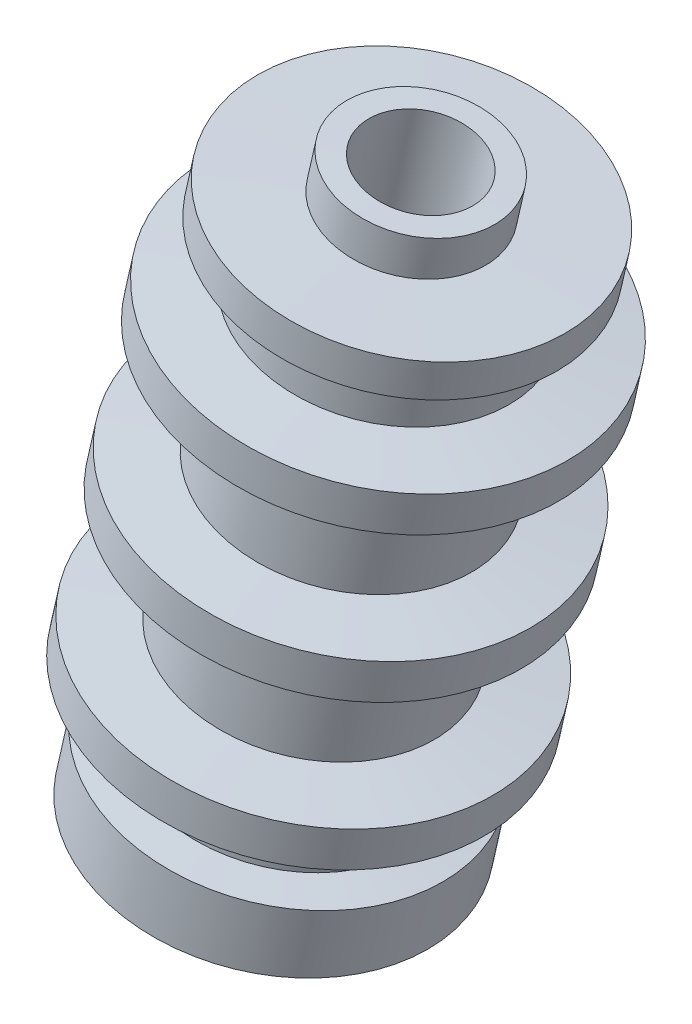
ISO-10303-21;
HEADER;
FILE_DESCRIPTION(('STEP AP214'),'2;1');
FILE_NAME('part.step','',(''),(''),'','','');
FILE_SCHEMA(('AUTOMOTIVE_DESIGN { 1 0 10303 214 1 1 1 1 }'));
ENDSEC;
DATA;
#1=APPLICATION_CONTEXT('core data for automotive mechanical design processes');
#2=APPLICATION_PROTOCOL_DEFINITION('international standard','automotive_design',2000,#1);
#3=PRODUCT_CONTEXT('',#1,'mechanical');
#4=PRODUCT('Part','Part','',(#3));
#5=PRODUCT_RELATED_PRODUCT_CATEGORY('part','',(#4));
#6=PRODUCT_DEFINITION_FORMATION('','',#4);
#7=PRODUCT_DEFINITION_CONTEXT('part definition',#1,'design');
#8=PRODUCT_DEFINITION('design','',#6,#7);
#9=PRODUCT_DEFINITION_SHAPE('','',#8);
#10=(LENGTH_UNIT() NAMED_UNIT(*) SI_UNIT(.MILLI.,.METRE.));
#11=(NAMED_UNIT(*) PLANE_ANGLE_UNIT() SI_UNIT($,.RADIAN.));
#12=(NAMED_UNIT(*) SI_UNIT($,.STERADIAN.) SOLID_ANGLE_UNIT());
#13=UNCERTAINTY_MEASURE_WITH_UNIT(LENGTH_MEASURE(1.E-05),#10,'distance_accuracy_value','');
#14=(GEOMETRIC_REPRESENTATION_CONTEXT(3) GLOBAL_UNCERTAINTY_ASSIGNED_CONTEXT((#13)) GLOBAL_UNIT_ASSIGNED_CONTEXT((#10,
#11,#12)) REPRESENTATION_CONTEXT('',''));
#15=CARTESIAN_POINT('',(0.,0.,0.));
#16=DIRECTION('',(0.,0.,1.));
#17=DIRECTION('',(1.,0.,0.));
#18=AXIS2_PLACEMENT_3D('',#15,#16,#17);
#19=CARTESIAN_POINT('',(23.4539001258529,-5.09677043690606,0.));
#20=DIRECTION('',(0.222520933956315,0.974927912181823,0.));
#21=DIRECTION('',(-0.974927912181823,0.222520933956315,0.));
#22=AXIS2_PLACEMENT_3D('',#19,#20,#21);
#23=CYLINDRICAL_SURFACE('',#22,4.5);
#24=CARTESIAN_POINT('',(23.2870094253804,-5.82796637106546,0.));
#25=DIRECTION('',(0.222520933956315,0.974927912181824,0.));
#26=DIRECTION('',(0.583888781232773,-0.133268804085998,-0.800820402467366));
#27=AXIS2_PLACEMENT_3D('',#24,#25,#26);
#28=CIRCLE('',#27,4.49999999995279);
#29=CARTESIAN_POINT('',(25.9145089409003,-6.42767598944616,-3.60369181106535));
#30=VERTEX_POINT('',#29);
#31=EDGE_CURVE('E83',#30,#30,#28,.F.);
#32=ORIENTED_EDGE('',*,*,#31,.F.);
#33=EDGE_LOOP('',(#32));
#34=FACE_BOUND('',#33,.T.);
#35=CARTESIAN_POINT('',(23.5095303593415,-4.85303845886247,0.));
#36=DIRECTION('',(-0.222520933956315,-0.974927912181824,0.));
#37=DIRECTION('',(-0.583888781246894,0.133268804089222,0.800820402456534));
#38=AXIS2_PLACEMENT_3D('',#35,#36,#37);
#39=CIRCLE('',#38,4.50000000001366);
#40=CARTESIAN_POINT('',(20.8820308437225,-4.25332884045915,3.60369181106535));
#41=VERTEX_POINT('',#40);
#42=EDGE_CURVE('E82',#41,#41,#39,.F.);
#43=ORIENTED_EDGE('',*,*,#42,.F.);
#44=EDGE_LOOP('',(#43));
#45=FACE_BOUND('',#44,.T.);
#46=ADVANCED_FACE('F15',(#34,#45),#23,.T.);
#47=CARTESIAN_POINT('',(23.2870094253804,-5.82796637106546,0.));
#48=DIRECTION('',(0.222520933956315,0.974927912181824,0.));
#49=DIRECTION('',(-0.974927912181824,0.222520933956315,0.));
#50=AXIS2_PLACEMENT_3D('',#47,#48,#49);
#51=CONICAL_SURFACE('',#50,4.49999999995279,1.48352986420512);
#52=ORIENTED_EDGE('',*,*,#31,.T.);
#53=EDGE_LOOP('',(#52));
#54=FACE_BOUND('',#53,.T.);
#55=CARTESIAN_POINT('',(23.2578073367081,-5.95590908114879,0.));
#56=DIRECTION('',(0.222520933956315,0.974927912181824,0.));
#57=DIRECTION('',(-0.974927912181824,0.222520933956315,0.));
#58=AXIS2_PLACEMENT_3D('',#55,#56,#57);
#59=CIRCLE('',#58,3.);
#60=CARTESIAN_POINT('',(20.3330236001626,-5.28834627927985,0.));
#61=VERTEX_POINT('',#60);
#62=EDGE_CURVE('E77',#61,#61,#59,.F.);
#63=ORIENTED_EDGE('',*,*,#62,.F.);
#64=EDGE_LOOP('',(#63));
#65=FACE_BOUND('',#64,.T.);
#66=ADVANCED_FACE('F306',(#54,#65),#51,.T.);
#67=CARTESIAN_POINT('',(23.5095303593415,-4.85303845886247,0.));
#68=DIRECTION('',(-0.222520933956315,-0.974927912181824,0.));
#69=DIRECTION('',(0.974927912181824,-0.222520933956315,0.));
#70=AXIS2_PLACEMENT_3D('',#67,#68,#69);
#71=CONICAL_SURFACE('',#70,4.50000000001366,1.48352986419718);
#72=CARTESIAN_POINT('',(23.5387324480195,-4.72509574875425,0.));
#73=DIRECTION('',(0.222520933956315,0.974927912181823,0.));
#74=DIRECTION('',(-0.974927912181823,0.222520933956315,0.));
#75=AXIS2_PLACEMENT_3D('',#72,#73,#74);
#76=CIRCLE('',#75,3.);
#77=CARTESIAN_POINT('',(20.6139487114741,-4.0575329468853,0.));
#78=VERTEX_POINT('',#77);
#79=EDGE_CURVE('E74',#78,#78,#76,.T.);
#80=ORIENTED_EDGE('',*,*,#79,.F.);
#81=EDGE_LOOP('',(#80));
#82=FACE_BOUND('',#81,.T.);
#83=ORIENTED_EDGE('',*,*,#42,.T.);
#84=EDGE_LOOP('',(#83));
#85=FACE_BOUND('',#84,.T.);
#86=ADVANCED_FACE('F297',(#82,#85),#71,.T.);
#87=CARTESIAN_POINT('',(22.4859340631429,-9.337706854897,0.));
#88=DIRECTION('',(0.222520933956315,0.974927912181824,0.));
#89=DIRECTION('',(-0.974927912181824,0.222520933956315,0.));
#90=AXIS2_PLACEMENT_3D('',#87,#88,#89);
#91=CYLINDRICAL_SURFACE('',#90,3.);
#92=ORIENTED_EDGE('',*,*,#62,.T.);
#93=EDGE_LOOP('',(#92));
#94=FACE_BOUND('',#93,.T.);
#95=CARTESIAN_POINT('',(22.626396618799,-8.72230018869823,0.));
#96=DIRECTION('',(-0.222520933956315,-0.974927912181824,0.));
#97=DIRECTION('',(-0.583888781231861,0.133268804085789,0.800820402468067));
#98=AXIS2_PLACEMENT_3D('',#95,#96,#97);
#99=CIRCLE('',#98,3.00000000006055);
#100=CARTESIAN_POINT('',(20.874730275068,-8.32249377643279,2.40246120745269));
#101=VERTEX_POINT('',#100);
#102=EDGE_CURVE('E71',#101,#101,#99,.T.);
#103=ORIENTED_EDGE('',*,*,#102,.F.);
#104=EDGE_LOOP('',(#103));
#105=FACE_BOUND('',#104,.T.);
#106=ADVANCED_FACE('F288',(#94,#105),#91,.T.);
#107=CARTESIAN_POINT('',(24.3106057215847,-1.34329797500605,0.));
#108=DIRECTION('',(0.222520933956315,0.974927912181823,0.));
#109=DIRECTION('',(-0.974927912181823,0.222520933956315,0.));
#110=AXIS2_PLACEMENT_3D('',#107,#108,#109);
#111=CYLINDRICAL_SURFACE('',#110,3.);
#112=ORIENTED_EDGE('',*,*,#79,.T.);
#113=EDGE_LOOP('',(#112));
#114=FACE_BOUND('',#113,.T.);
#115=CARTESIAN_POINT('',(24.1701431659301,-1.95870464119827,0.));
#116=DIRECTION('',(0.222520933956315,0.974927912181824,0.));
#117=DIRECTION('',(0.58388878124231,-0.133268804088175,-0.80082040246005));
#118=AXIS2_PLACEMENT_3D('',#115,#116,#117);
#119=CIRCLE('',#118,3.0000000000196);
#120=CARTESIAN_POINT('',(25.9218095096685,-2.35851105346541,-2.40246120739585));
#121=VERTEX_POINT('',#120);
#122=EDGE_CURVE('E68',#121,#121,#119,.T.);
#123=ORIENTED_EDGE('',*,*,#122,.F.);
#124=EDGE_LOOP('',(#123));
#125=FACE_BOUND('',#124,.T.);
#126=ADVANCED_FACE('F279',(#114,#125),#111,.T.);
#127=CARTESIAN_POINT('',(22.5971945301273,-8.85024289877863,0.));
#128=DIRECTION('',(-0.222520933956315,-0.974927912181824,0.));
#129=DIRECTION('',(0.974927912181824,-0.222520933956315,0.));
#130=AXIS2_PLACEMENT_3D('',#127,#128,#129);
#131=CONICAL_SURFACE('',#130,4.49999999975408,1.48352986419518);
#132=CARTESIAN_POINT('',(22.5971945301211,-8.85024289880609,0.));
#133=DIRECTION('',(0.222520933956315,0.974927912181824,0.));
#134=DIRECTION('',(-0.974927912181824,0.222520933956315,0.));
#135=AXIS2_PLACEMENT_3D('',#132,#133,#134);
#136=CIRCLE('',#135,4.5);
#137=CARTESIAN_POINT('',(18.2100189253029,-7.84889869600267,0.));
#138=VERTEX_POINT('',#137);
#139=EDGE_CURVE('E65',#138,#138,#136,.F.);
#140=ORIENTED_EDGE('',*,*,#139,.F.);
#141=EDGE_LOOP('',(#140));
#142=FACE_BOUND('',#141,.T.);
#143=ORIENTED_EDGE('',*,*,#102,.T.);
#144=EDGE_LOOP('',(#143));
#145=FACE_BOUND('',#144,.T.);
#146=ADVANCED_FACE('F270',(#142,#145),#131,.T.);
#147=CARTESIAN_POINT('',(24.1993452546079,-1.830761931091,0.));
#148=DIRECTION('',(0.222520933956315,0.974927912181824,0.));
#149=DIRECTION('',(-0.974927912181824,0.222520933956315,0.));
#150=AXIS2_PLACEMENT_3D('',#147,#148,#149);
#151=CONICAL_SURFACE('',#150,4.49999999995069,1.48352986418908);
#152=ORIENTED_EDGE('',*,*,#122,.T.);
#153=EDGE_LOOP('',(#152));
#154=FACE_BOUND('',#153,.T.);
#155=CARTESIAN_POINT('',(24.1993452546065,-1.83076193109695,0.));
#156=DIRECTION('',(0.222520933956315,0.974927912181823,0.));
#157=DIRECTION('',(-0.974927912181823,0.222520933956315,0.));
#158=AXIS2_PLACEMENT_3D('',#155,#156,#157);
#159=CIRCLE('',#158,4.5);
#160=CARTESIAN_POINT('',(19.8121696497883,-0.829417728293534,0.));
#161=VERTEX_POINT('',#160);
#162=EDGE_CURVE('E62',#161,#161,#159,.T.);
#163=ORIENTED_EDGE('',*,*,#162,.F.);
#164=EDGE_LOOP('',(#163));
#165=FACE_BOUND('',#164,.T.);
#166=ADVANCED_FACE('F261',(#154,#165),#151,.T.);
#167=CARTESIAN_POINT('',(22.4859340631429,-9.337706854897,0.));
#168=DIRECTION('',(0.222520933956315,0.974927912181824,0.));
#169=DIRECTION('',(-0.974927912181824,0.222520933956315,0.));
#170=AXIS2_PLACEMENT_3D('',#167,#168,#169);
#171=CYLINDRICAL_SURFACE('',#170,4.5);
#172=ORIENTED_EDGE('',*,*,#139,.T.);
#173=EDGE_LOOP('',(#172));
#174=FACE_BOUND('',#173,.T.);
#175=CARTESIAN_POINT('',(22.3746735961624,-9.82517081099837,0.));
#176=DIRECTION('',(0.222520933956315,0.974927912181824,0.));
#177=DIRECTION('',(0.583888781237553,-0.133268804087089,-0.8008204024637));
#178=AXIS2_PLACEMENT_3D('',#175,#176,#177);
#179=CIRCLE('',#178,4.49999999997339);
#180=CARTESIAN_POINT('',(25.0021731117158,-10.4248804293867,-3.60369181106535));
#181=VERTEX_POINT('',#180);
#182=EDGE_CURVE('E59',#181,#181,#179,.F.);
#183=ORIENTED_EDGE('',*,*,#182,.F.);
#184=EDGE_LOOP('',(#183));
#185=FACE_BOUND('',#184,.T.);
#186=ADVANCED_FACE('F252',(#174,#185),#171,.T.);
#187=CARTESIAN_POINT('',(24.3106057215847,-1.34329797500605,0.));
#188=DIRECTION('',(0.222520933956315,0.974927912181823,0.));
#189=DIRECTION('',(-0.974927912181823,0.222520933956315,0.));
#190=AXIS2_PLACEMENT_3D('',#187,#188,#189);
#191=CYLINDRICAL_SURFACE('',#190,4.5);
#192=ORIENTED_EDGE('',*,*,#162,.T.);
#193=EDGE_LOOP('',(#192));
#194=FACE_BOUND('',#193,.T.);
#195=CARTESIAN_POINT('',(24.4218661885596,-0.85583401892956,0.));
#196=DIRECTION('',(-0.222520933956315,-0.974927912181824,0.));
#197=DIRECTION('',(-0.583888781245767,0.133268804088964,0.800820402457398));
#198=AXIS2_PLACEMENT_3D('',#195,#196,#197);
#199=CIRCLE('',#198,4.50000000007979);
#200=CARTESIAN_POINT('',(21.794366672907,-0.256124400518587,3.60369181112219));
#201=VERTEX_POINT('',#200);
#202=EDGE_CURVE('E56',#201,#201,#199,.F.);
#203=ORIENTED_EDGE('',*,*,#202,.F.);
#204=EDGE_LOOP('',(#203));
#205=FACE_BOUND('',#204,.T.);
#206=ADVANCED_FACE('F243',(#194,#205),#191,.T.);
#207=CARTESIAN_POINT('',(22.3746735961636,-9.82517081099279,0.));
#208=DIRECTION('',(0.222520933956315,0.974927912181824,0.));
#209=DIRECTION('',(-0.974927912181824,0.222520933956315,0.));
#210=AXIS2_PLACEMENT_3D('',#207,#208,#209);
#211=CONICAL_SURFACE('',#210,4.50000000009857,1.48352986420394);
#212=ORIENTED_EDGE('',*,*,#182,.T.);
#213=EDGE_LOOP('',(#212));
#214=FACE_BOUND('',#213,.T.);
#215=CARTESIAN_POINT('',(22.3454715074872,-9.95311352109428,0.));
#216=DIRECTION('',(0.222520933956315,0.974927912181824,0.));
#217=DIRECTION('',(-0.974927912181824,0.222520933956315,0.));
#218=AXIS2_PLACEMENT_3D('',#215,#216,#217);
#219=CIRCLE('',#218,3.);
#220=CARTESIAN_POINT('',(19.4206877709417,-9.28555071922533,0.));
#221=VERTEX_POINT('',#220);
#222=EDGE_CURVE('E53',#221,#221,#219,.F.);
#223=ORIENTED_EDGE('',*,*,#222,.F.);
#224=EDGE_LOOP('',(#223));
#225=FACE_BOUND('',#224,.T.);
#226=ADVANCED_FACE('F234',(#214,#225),#211,.T.);
#227=CARTESIAN_POINT('',(24.421866188555,-0.855834018949671,0.));
#228=DIRECTION('',(-0.222520933956315,-0.974927912181824,0.));
#229=DIRECTION('',(0.974927912181824,-0.222520933956315,0.));
#230=AXIS2_PLACEMENT_3D('',#227,#228,#229);
#231=CONICAL_SURFACE('',#230,4.50000000040933,1.48352986420029);
#232=CARTESIAN_POINT('',(24.4510682772404,-0.727891308808766,0.));
#233=DIRECTION('',(0.222520933956315,0.974927912181823,0.));
#234=DIRECTION('',(-0.974927912181823,0.222520933956315,0.));
#235=AXIS2_PLACEMENT_3D('',#232,#233,#234);
#236=CIRCLE('',#235,3.);
#237=CARTESIAN_POINT('',(21.5262845406949,-0.0603285069398208,0.));
#238=VERTEX_POINT('',#237);
#239=EDGE_CURVE('E50',#238,#238,#236,.T.);
#240=ORIENTED_EDGE('',*,*,#239,.F.);
#241=EDGE_LOOP('',(#240));
#242=FACE_BOUND('',#241,.T.);
#243=ORIENTED_EDGE('',*,*,#202,.T.);
#244=EDGE_LOOP('',(#243));
#245=FACE_BOUND('',#244,.T.);
#246=ADVANCED_FACE('F225',(#242,#245),#231,.T.);
#247=CARTESIAN_POINT('',(22.4859340631429,-9.337706854897,0.));
#248=DIRECTION('',(0.222520933956315,0.974927912181824,0.));
#249=DIRECTION('',(-0.974927912181824,0.222520933956315,0.));
#250=AXIS2_PLACEMENT_3D('',#247,#248,#249);
#251=CYLINDRICAL_SURFACE('',#250,3.);
#252=ORIENTED_EDGE('',*,*,#222,.T.);
#253=EDGE_LOOP('',(#252));
#254=FACE_BOUND('',#253,.T.);
#255=CARTESIAN_POINT('',(22.0240619053868,-11.3613009970304,0.));
#256=DIRECTION('',(-0.222520933956315,-0.974927912181824,0.));
#257=DIRECTION('',(-0.583888781236389,0.133268804086823,0.800820402464593));
#258=AXIS2_PLACEMENT_3D('',#255,#256,#257);
#259=CIRCLE('',#258,3.00000000000259);
#260=CARTESIAN_POINT('',(20.2723955616761,-10.9614945847696,2.40246120739585));
#261=VERTEX_POINT('',#260);
#262=EDGE_CURVE('E47',#261,#261,#259,.T.);
#263=ORIENTED_EDGE('',*,*,#262,.F.);
#264=EDGE_LOOP('',(#263));
#265=FACE_BOUND('',#264,.T.);
#266=ADVANCED_FACE('F216',(#254,#265),#251,.T.);
#267=CARTESIAN_POINT('',(24.3106057215847,-1.34329797500605,0.));
#268=DIRECTION('',(0.222520933956315,0.974927912181823,0.));
#269=DIRECTION('',(-0.974927912181823,0.222520933956315,0.));
#270=AXIS2_PLACEMENT_3D('',#267,#268,#269);
#271=CYLINDRICAL_SURFACE('',#270,3.);
#272=ORIENTED_EDGE('',*,*,#239,.T.);
#273=EDGE_LOOP('',(#272));
#274=FACE_BOUND('',#273,.T.);
#275=CARTESIAN_POINT('',(24.7724778793392,0.680296167120388,0.));
#276=DIRECTION('',(0.222520933956315,0.974927912181824,0.));
#277=DIRECTION('',(0.583888781229777,-0.133268804085315,-0.800820402469664));
#278=AXIS2_PLACEMENT_3D('',#275,#276,#277);
#279=CIRCLE('',#278,3.00000000005457);
#280=CARTESIAN_POINT('',(26.5241442230604,0.280489754857172,-2.40246120745269));
#281=VERTEX_POINT('',#280);
#282=EDGE_CURVE('E44',#281,#281,#279,.T.);
#283=ORIENTED_EDGE('',*,*,#282,.F.);
#284=EDGE_LOOP('',(#283));
#285=FACE_BOUND('',#284,.T.);
#286=ADVANCED_FACE('F207',(#274,#285),#271,.T.);
#287=CARTESIAN_POINT('',(22.0075140551379,-11.4338018660834,0.));
#288=DIRECTION('',(-0.222520933956315,-0.974927912181824,0.));
#289=DIRECTION('',(0.974927912181824,-0.222520933956315,0.));
#290=AXIS2_PLACEMENT_3D('',#287,#288,#289);
#291=CONICAL_SURFACE('',#290,3.84999999997625,1.48352986420118);
#292=CARTESIAN_POINT('',(22.0075140551368,-11.4338018660879,0.));
#293=DIRECTION('',(0.222520933956315,0.974927912181824,0.));
#294=DIRECTION('',(-0.974927912181824,0.222520933956315,0.));
#295=AXIS2_PLACEMENT_3D('',#292,#293,#294);
#296=CIRCLE('',#295,3.85);
#297=CARTESIAN_POINT('',(18.2540415932368,-10.5770962703561,0.));
#298=VERTEX_POINT('',#297);
#299=EDGE_CURVE('E43',#298,#298,#296,.F.);
#300=ORIENTED_EDGE('',*,*,#299,.F.);
#301=EDGE_LOOP('',(#300));
#302=FACE_BOUND('',#301,.T.);
#303=ORIENTED_EDGE('',*,*,#262,.T.);
#304=EDGE_LOOP('',(#303));
#305=FACE_BOUND('',#304,.T.);
#306=ADVANCED_FACE('F198',(#302,#305),#291,.T.);
#307=CARTESIAN_POINT('',(24.7890257295943,0.752797036200266,0.));
#308=DIRECTION('',(0.222520933956315,0.974927912181824,0.));
#309=DIRECTION('',(-0.974927912181824,0.222520933956315,0.));
#310=AXIS2_PLACEMENT_3D('',#307,#308,#309);
#311=CONICAL_SURFACE('',#310,3.85000000022026,1.48352986418862);
#312=ORIENTED_EDGE('',*,*,#282,.T.);
#313=EDGE_LOOP('',(#312));
#314=FACE_BOUND('',#313,.T.);
#315=CARTESIAN_POINT('',(24.7890257295908,0.752797036184879,0.));
#316=DIRECTION('',(0.222520933956315,0.974927912181823,0.));
#317=DIRECTION('',(-0.974927912181823,0.222520933956315,0.));
#318=AXIS2_PLACEMENT_3D('',#315,#316,#317);
#319=CIRCLE('',#318,3.85);
#320=CARTESIAN_POINT('',(21.0355532676908,1.60950263191669,0.));
#321=VERTEX_POINT('',#320);
#322=EDGE_CURVE('E40',#321,#321,#319,.T.);
#323=ORIENTED_EDGE('',*,*,#322,.F.);
#324=EDGE_LOOP('',(#323));
#325=FACE_BOUND('',#324,.T.);
#326=ADVANCED_FACE('F189',(#314,#325),#311,.T.);
#327=CARTESIAN_POINT('',(21.8100242036478,-12.2990614403943,0.));
#328=DIRECTION('',(0.222520933956315,0.974927912181824,0.));
#329=DIRECTION('',(-0.974927912181824,0.222520933956315,0.));
#330=AXIS2_PLACEMENT_3D('',#327,#328,#329);
#331=CYLINDRICAL_SURFACE('',#330,3.85);
#332=ORIENTED_EDGE('',*,*,#299,.T.);
#333=EDGE_LOOP('',(#332));
#334=FACE_BOUND('',#333,.T.);
#335=CARTESIAN_POINT('',(21.6403545141089,-13.0424329211879,0.));
#336=DIRECTION('',(0.222520933956315,0.974927912181824,0.));
#337=DIRECTION('',(-0.974927912181824,0.222520933956315,0.));
#338=AXIS2_PLACEMENT_3D('',#335,#336,#337);
#339=CIRCLE('',#338,3.85);
#340=CARTESIAN_POINT('',(17.8868820522089,-12.1857273254561,0.));
#341=VERTEX_POINT('',#340);
#342=EDGE_CURVE('E18',#341,#341,#339,.T.);
#343=ORIENTED_EDGE('',*,*,#342,.T.);
#344=EDGE_LOOP('',(#343));
#345=FACE_BOUND('',#344,.T.);
#346=ADVANCED_FACE('F108',(#334,#345),#331,.T.);
#347=CARTESIAN_POINT('',(24.9865155810798,1.61805661049125,0.));
#348=DIRECTION('',(0.222520933956315,0.974927912181823,0.));
#349=DIRECTION('',(-0.974927912181823,0.222520933956315,0.));
#350=AXIS2_PLACEMENT_3D('',#347,#348,#349);
#351=CYLINDRICAL_SURFACE('',#350,3.85);
#352=ORIENTED_EDGE('',*,*,#322,.T.);
#353=EDGE_LOOP('',(#352));
#354=FACE_BOUND('',#353,.T.);
#355=CARTESIAN_POINT('',(24.9954687443829,1.65728298192213,0.));
#356=DIRECTION('',(-0.222520933956315,-0.974927912181824,0.));
#357=DIRECTION('',(-0.583888781244704,0.133268804088721,0.800820402458214));
#358=AXIS2_PLACEMENT_3D('',#355,#356,#357);
#359=CIRCLE('',#358,3.85000000002806);
#360=CARTESIAN_POINT('',(22.7474969365744,2.17036787766745,3.0831585494866));
#361=VERTEX_POINT('',#360);
#362=EDGE_CURVE('E37',#361,#361,#359,.F.);
#363=ORIENTED_EDGE('',*,*,#362,.F.);
#364=EDGE_LOOP('',(#363));
#365=FACE_BOUND('',#364,.T.);
#366=ADVANCED_FACE('F98',(#354,#365),#351,.T.);
#367=CARTESIAN_POINT('',(23.3044375406417,-13.4222490128374,-2.28233814701712));
#368=DIRECTION('',(0.222520933956315,0.974927912181824,0.));
#369=DIRECTION('',(-0.974927912181824,0.222520933956315,0.));
#370=AXIS2_PLACEMENT_3D('',#367,#368,#369);
#371=PLANE('',#370);
#372=ORIENTED_EDGE('',*,*,#342,.F.);
#373=EDGE_LOOP('',(#372));
#374=FACE_BOUND('',#373,.T.);
#375=CARTESIAN_POINT('',(21.6403545141089,-13.0424329211879,0.));
#376=DIRECTION('',(0.222520933956315,0.974927912181824,0.));
#377=DIRECTION('',(-0.974927912181824,0.222520933956315,0.));
#378=AXIS2_PLACEMENT_3D('',#375,#376,#377);
#379=CIRCLE('',#378,2.85);
#380=CARTESIAN_POINT('',(18.8618099643907,-12.4082482594124,0.));
#381=VERTEX_POINT('',#380);
#382=EDGE_CURVE('E36',#381,#381,#379,.F.);
#383=ORIENTED_EDGE('',*,*,#382,.F.);
#384=EDGE_LOOP('',(#383));
#385=FACE_BOUND('',#384,.T.);
#386=ADVANCED_FACE('F95',(#374,#385),#371,.F.);
#387=CARTESIAN_POINT('',(24.9954687443822,1.6572829819192,0.));
#388=DIRECTION('',(-0.222520933956315,-0.974927912181824,0.));
#389=DIRECTION('',(0.974927912181824,-0.222520933956315,0.));
#390=AXIS2_PLACEMENT_3D('',#387,#388,#389);
#391=CONICAL_SURFACE('',#390,3.8500000009337,1.5620696805423);
#392=CARTESIAN_POINT('',(24.999352565925,1.67429911591028,0.));
#393=DIRECTION('',(0.222520933956315,0.974927912181824,0.));
#394=DIRECTION('',(-0.974927912181824,0.222520933956315,0.));
#395=AXIS2_PLACEMENT_3D('',#392,#393,#394);
#396=CIRCLE('',#395,1.85);
#397=CARTESIAN_POINT('',(23.1957359283887,2.08596284372947,0.));
#398=VERTEX_POINT('',#397);
#399=EDGE_CURVE('E33',#398,#398,#396,.T.);
#400=ORIENTED_EDGE('',*,*,#399,.F.);
#401=EDGE_LOOP('',(#400));
#402=FACE_BOUND('',#401,.T.);
#403=ORIENTED_EDGE('',*,*,#362,.T.);
#404=EDGE_LOOP('',(#403));
#405=FACE_BOUND('',#404,.T.);
#406=ADVANCED_FACE('F97',(#402,#405),#391,.T.);
#407=CARTESIAN_POINT('',(21.6167104035747,-13.1460245379797,0.));
#408=DIRECTION('',(0.222520933956315,0.974927912181824,0.));
#409=DIRECTION('',(-0.974927912181824,0.222520933956315,0.));
#410=AXIS2_PLACEMENT_3D('',#407,#408,#409);
#411=CYLINDRICAL_SURFACE('',#410,2.85);
#412=ORIENTED_EDGE('',*,*,#382,.T.);
#413=EDGE_LOOP('',(#412));
#414=FACE_BOUND('',#413,.T.);
#415=CARTESIAN_POINT('',(21.573598233922,-13.3349112948425,0.));
#416=DIRECTION('',(0.222520933956315,0.974927912181824,0.));
#417=DIRECTION('',(-0.974927912181824,0.222520933956315,0.));
#418=AXIS2_PLACEMENT_3D('',#415,#416,#417);
#419=CIRCLE('',#418,2.85);
#420=CARTESIAN_POINT('',(18.7950536842038,-12.700726633067,0.));
#421=VERTEX_POINT('',#420);
#422=EDGE_CURVE('E32',#421,#421,#419,.T.);
#423=ORIENTED_EDGE('',*,*,#422,.T.);
#424=EDGE_LOOP('',(#423));
#425=FACE_BOUND('',#424,.T.);
#426=ADVANCED_FACE('F92',(#414,#425),#411,.T.);
#427=CARTESIAN_POINT('',(25.1106130329032,2.1617630720012,0.));
#428=DIRECTION('',(0.222520933956315,0.974927912181824,0.));
#429=DIRECTION('',(-0.974927912181824,0.222520933956315,0.));
#430=AXIS2_PLACEMENT_3D('',#427,#428,#429);
#431=CYLINDRICAL_SURFACE('',#430,1.85);
#432=CARTESIAN_POINT('',(25.2218734998856,2.64922702811055,0.));
#433=DIRECTION('',(-0.222520933956315,-0.974927912181824,0.));
#434=DIRECTION('',(-0.780742163010563,0.178199303888412,-0.598904569185503));
#435=AXIS2_PLACEMENT_3D('',#432,#433,#434);
#436=CIRCLE('',#435,1.84999999996868);
#437=CARTESIAN_POINT('',(23.7775004983405,2.97889574029853,-1.10797345297442));
#438=VERTEX_POINT('',#437);
#439=EDGE_CURVE('E27',#438,#438,#436,.F.);
#440=ORIENTED_EDGE('',*,*,#439,.F.);
#441=EDGE_LOOP('',(#440));
#442=FACE_BOUND('',#441,.T.);
#443=ORIENTED_EDGE('',*,*,#399,.T.);
#444=EDGE_LOOP('',(#443));
#445=FACE_BOUND('',#444,.T.);
#446=ADVANCED_FACE('F127',(#442,#445),#431,.T.);
#447=CARTESIAN_POINT('',(22.3326536495335,-13.5081607401563,-1.0410665232008));
#448=DIRECTION('',(0.222520933956315,0.974927912181824,0.));
#449=DIRECTION('',(-0.974927912181824,0.222520933956315,0.));
#450=AXIS2_PLACEMENT_3D('',#447,#448,#449);
#451=PLANE('',#450);
#452=ORIENTED_EDGE('',*,*,#422,.F.);
#453=EDGE_LOOP('',(#452));
#454=FACE_BOUND('',#453,.T.);
#455=CARTESIAN_POINT('',(21.5735982339307,-13.3349112948043,0.));
#456=DIRECTION('',(-0.222520933956352,-0.974927912181815,0.));
#457=DIRECTION('',(0.974927912181815,-0.222520933956352,0.));
#458=AXIS2_PLACEMENT_3D('',#455,#456,#457);
#459=CIRCLE('',#458,1.35724703197264);
#460=CARTESIAN_POINT('',(22.8968162491268,-13.6369271719684,0.));
#461=VERTEX_POINT('',#460);
#462=EDGE_CURVE('E22',#461,#461,#459,.F.);
#463=ORIENTED_EDGE('',*,*,#462,.T.);
#464=EDGE_LOOP('',(#463));
#465=FACE_BOUND('',#464,.T.);
#466=ADVANCED_FACE('F120',(#454,#465),#451,.F.);
#467=CARTESIAN_POINT('',(25.2218734998822,2.64922702809586,0.));
#468=DIRECTION('',(-0.222520933956315,-0.974927912181824,0.));
#469=DIRECTION('',(0.974927912181824,-0.222520933956315,0.));
#470=AXIS2_PLACEMENT_3D('',#467,#468,#469);
#471=CONICAL_SURFACE('',#470,1.84999999988519,1.56206968051339);
#472=ORIENTED_EDGE('',*,*,#439,.T.);
#473=EDGE_LOOP('',(#472));
#474=FACE_BOUND('',#473,.T.);
#475=CARTESIAN_POINT('',(25.2229415507957,2.65390646489611,0.));
#476=DIRECTION('',(-0.222520933956315,-0.974927912181824,0.));
#477=DIRECTION('',(-0.583888781241388,0.133268804087996,0.800820402460753));
#478=AXIS2_PLACEMENT_3D('',#475,#476,#477);
#479=CIRCLE('',#478,1.30000000000282);
#480=CARTESIAN_POINT('',(24.4638861351802,2.82715591021088,1.04106652320124));
#481=VERTEX_POINT('',#480);
#482=EDGE_CURVE('E10',#481,#481,#479,.T.);
#483=ORIENTED_EDGE('',*,*,#482,.T.);
#484=EDGE_LOOP('',(#483));
#485=FACE_BOUND('',#484,.T.);
#486=ADVANCED_FACE('F114',(#474,#485),#471,.T.);
#487=CARTESIAN_POINT('',(21.5735982339323,-13.3349112947973,0.));
#488=DIRECTION('',(-0.222520933956352,-0.974927912181815,0.));
#489=DIRECTION('',(0.974927912181815,-0.222520933956352,0.));
#490=AXIS2_PLACEMENT_3D('',#487,#488,#489);
#491=CONICAL_SURFACE('',#490,1.35724703197262,0.0034906585035194);
#492=ORIENTED_EDGE('',*,*,#482,.F.);
#493=EDGE_LOOP('',(#492));
#494=FACE_BOUND('',#493,.T.);
#495=ORIENTED_EDGE('',*,*,#462,.F.);
#496=EDGE_LOOP('',(#495));
#497=FACE_BOUND('',#496,.T.);
#498=ADVANCED_FACE('F112',(#494,#497),#491,.F.);
#499=CLOSED_SHELL('',(#46,#66,#86,#106,#126,#146,#166,#186,#206,#226,#246,#266,#286,#306,#326,
#346,#366,#386,#406,#426,#446,#466,#486,#498));
#500=MANIFOLD_SOLID_BREP('B1',#499);
#501=ADVANCED_BREP_SHAPE_REPRESENTATION('',(#18,#500),#14);
#502=SHAPE_DEFINITION_REPRESENTATION(#9,#501);
ENDSEC;
END-ISO-10303-21;
